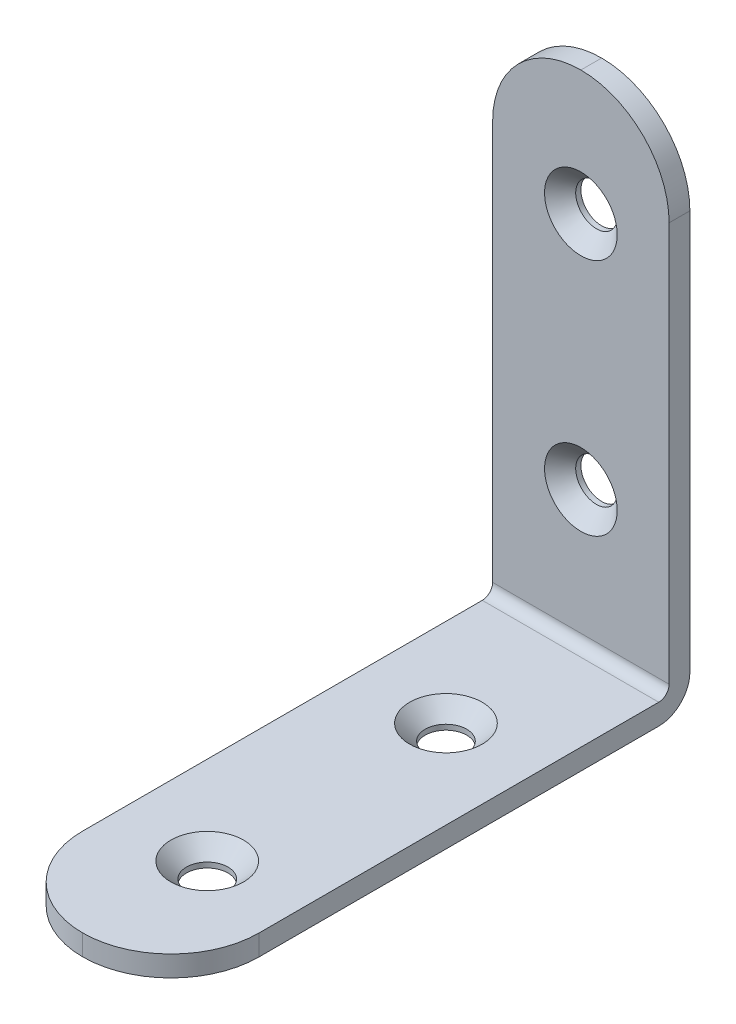
ISO-10303-21;
HEADER;
FILE_DESCRIPTION(('STEP AP214'),'2;1');
FILE_NAME('part.step','',(''),(''),'','','');
FILE_SCHEMA(('AUTOMOTIVE_DESIGN { 1 0 10303 214 1 1 1 1 }'));
ENDSEC;
DATA;
#1=APPLICATION_CONTEXT('core data for automotive mechanical design processes');
#2=APPLICATION_PROTOCOL_DEFINITION('international standard','automotive_design',2000,#1);
#3=PRODUCT_CONTEXT('',#1,'mechanical');
#4=PRODUCT('Part','Part','',(#3));
#5=PRODUCT_RELATED_PRODUCT_CATEGORY('part','',(#4));
#6=PRODUCT_DEFINITION_FORMATION('','',#4);
#7=PRODUCT_DEFINITION_CONTEXT('part definition',#1,'design');
#8=PRODUCT_DEFINITION('design','',#6,#7);
#9=PRODUCT_DEFINITION_SHAPE('','',#8);
#10=(LENGTH_UNIT() NAMED_UNIT(*) SI_UNIT(.MILLI.,.METRE.));
#11=(NAMED_UNIT(*) PLANE_ANGLE_UNIT() SI_UNIT($,.RADIAN.));
#12=(NAMED_UNIT(*) SI_UNIT($,.STERADIAN.) SOLID_ANGLE_UNIT());
#13=UNCERTAINTY_MEASURE_WITH_UNIT(LENGTH_MEASURE(1.E-05),#10,'distance_accuracy_value','');
#14=(GEOMETRIC_REPRESENTATION_CONTEXT(3) GLOBAL_UNCERTAINTY_ASSIGNED_CONTEXT((#13)) GLOBAL_UNIT_ASSIGNED_CONTEXT((#10,
#11,#12)) REPRESENTATION_CONTEXT('',''));
#15=CARTESIAN_POINT('',(0.,0.,0.));
#16=DIRECTION('',(0.,0.,1.));
#17=DIRECTION('',(1.,0.,0.));
#18=AXIS2_PLACEMENT_3D('',#15,#16,#17);
#19=CARTESIAN_POINT('',(-8.5,2.,50.));
#20=DIRECTION('',(0.,1.,0.));
#21=DIRECTION('',(0.,0.,1.));
#22=AXIS2_PLACEMENT_3D('',#19,#20,#21);
#23=PLANE('',#22);
#24=CARTESIAN_POINT('',(0.,2.,15.));
#25=DIRECTION('',(0.,1.,0.));
#26=DIRECTION('',(0.,0.,1.));
#27=AXIS2_PLACEMENT_3D('',#24,#25,#26);
#28=CIRCLE('',#27,3.5);
#29=CARTESIAN_POINT('',(0.,2.,18.5));
#30=VERTEX_POINT('',#29);
#31=EDGE_CURVE('E211',#30,#30,#28,.F.);
#32=ORIENTED_EDGE('',*,*,#31,.T.);
#33=EDGE_LOOP('',(#32));
#34=FACE_BOUND('',#33,.T.);
#35=CARTESIAN_POINT('',(0.,2.,38.));
#36=DIRECTION('',(0.,1.,0.));
#37=DIRECTION('',(0.,0.,1.));
#38=AXIS2_PLACEMENT_3D('',#35,#36,#37);
#39=CIRCLE('',#38,3.5);
#40=CARTESIAN_POINT('',(0.,2.,41.5));
#41=VERTEX_POINT('',#40);
#42=EDGE_CURVE('E208',#41,#41,#39,.F.);
#43=ORIENTED_EDGE('',*,*,#42,.T.);
#44=EDGE_LOOP('',(#43));
#45=FACE_BOUND('',#44,.T.);
#46=CARTESIAN_POINT('',(0.,2.,41.5));
#47=DIRECTION('',(0.,1.,0.));
#48=DIRECTION('',(0.,0.,1.));
#49=AXIS2_PLACEMENT_3D('',#46,#47,#48);
#50=CIRCLE('',#49,8.5);
#51=CARTESIAN_POINT('',(-8.5,2.,41.5));
#52=VERTEX_POINT('',#51);
#53=CARTESIAN_POINT('',(0.,2.,50.));
#54=VERTEX_POINT('',#53);
#55=EDGE_CURVE('E50',#52,#54,#50,.T.);
#56=ORIENTED_EDGE('',*,*,#55,.T.);
#57=CARTESIAN_POINT('',(0.,2.,41.5));
#58=DIRECTION('',(0.,1.,0.));
#59=DIRECTION('',(0.,0.,1.));
#60=AXIS2_PLACEMENT_3D('',#57,#58,#59);
#61=CIRCLE('',#60,8.5);
#62=CARTESIAN_POINT('',(8.5,2.,41.5));
#63=VERTEX_POINT('',#62);
#64=EDGE_CURVE('E198',#54,#63,#61,.T.);
#65=ORIENTED_EDGE('',*,*,#64,.T.);
#66=DIRECTION('',(0.,0.,1.));
#67=VECTOR('',#66,1.);
#68=CARTESIAN_POINT('',(8.5,2.,50.));
#69=LINE('',#68,#67);
#70=CARTESIAN_POINT('',(8.5,2.,3.));
#71=VERTEX_POINT('',#70);
#72=EDGE_CURVE('E146',#71,#63,#69,.T.);
#73=ORIENTED_EDGE('',*,*,#72,.F.);
#74=DIRECTION('',(1.,0.,0.));
#75=VECTOR('',#74,1.);
#76=CARTESIAN_POINT('',(-8.5,2.,3.));
#77=LINE('',#76,#75);
#78=CARTESIAN_POINT('',(-8.5,2.,3.));
#79=VERTEX_POINT('',#78);
#80=EDGE_CURVE('E160',#79,#71,#77,.T.);
#81=ORIENTED_EDGE('',*,*,#80,.F.);
#82=DIRECTION('',(0.,0.,1.));
#83=VECTOR('',#82,1.);
#84=CARTESIAN_POINT('',(-8.5,2.,50.));
#85=LINE('',#84,#83);
#86=EDGE_CURVE('E134',#79,#52,#85,.T.);
#87=ORIENTED_EDGE('',*,*,#86,.T.);
#88=EDGE_LOOP('',(#56,#65,#73,#81,#87));
#89=FACE_BOUND('',#88,.T.);
#90=ADVANCED_FACE('F35',(#34,#45,#89),#23,.T.);
#91=CARTESIAN_POINT('',(-8.5,3.,3.));
#92=DIRECTION('',(1.,0.,0.));
#93=DIRECTION('',(0.,0.,-1.));
#94=AXIS2_PLACEMENT_3D('',#91,#92,#93);
#95=CYLINDRICAL_SURFACE('',#94,1.);
#96=ORIENTED_EDGE('',*,*,#80,.T.);
#97=CARTESIAN_POINT('',(8.5,3.,3.));
#98=DIRECTION('',(-1.,0.,0.));
#99=DIRECTION('',(0.,0.,-1.));
#100=AXIS2_PLACEMENT_3D('',#97,#98,#99);
#101=CIRCLE('',#100,1.);
#102=CARTESIAN_POINT('',(8.5,3.,2.));
#103=VERTEX_POINT('',#102);
#104=EDGE_CURVE('E143',#103,#71,#101,.T.);
#105=ORIENTED_EDGE('',*,*,#104,.F.);
#106=DIRECTION('',(1.,0.,0.));
#107=VECTOR('',#106,1.);
#108=CARTESIAN_POINT('',(-8.5,3.,2.));
#109=LINE('',#108,#107);
#110=CARTESIAN_POINT('',(-8.5,3.,2.));
#111=VERTEX_POINT('',#110);
#112=EDGE_CURVE('E162',#111,#103,#109,.T.);
#113=ORIENTED_EDGE('',*,*,#112,.F.);
#114=CARTESIAN_POINT('',(-8.5,3.,3.));
#115=DIRECTION('',(-1.,0.,0.));
#116=DIRECTION('',(0.,0.,-1.));
#117=AXIS2_PLACEMENT_3D('',#114,#115,#116);
#118=CIRCLE('',#117,1.);
#119=EDGE_CURVE('E156',#111,#79,#118,.T.);
#120=ORIENTED_EDGE('',*,*,#119,.T.);
#121=EDGE_LOOP('',(#96,#105,#113,#120));
#122=FACE_BOUND('',#121,.T.);
#123=ADVANCED_FACE('F242',(#122),#95,.F.);
#124=CARTESIAN_POINT('',(-8.5,3.,2.));
#125=DIRECTION('',(0.,0.,1.));
#126=DIRECTION('',(0.,-1.,0.));
#127=AXIS2_PLACEMENT_3D('',#124,#125,#126);
#128=PLANE('',#127);
#129=CARTESIAN_POINT('',(0.,15.,2.));
#130=DIRECTION('',(0.,0.,1.));
#131=DIRECTION('',(0.,-1.,0.));
#132=AXIS2_PLACEMENT_3D('',#129,#130,#131);
#133=CIRCLE('',#132,3.5);
#134=CARTESIAN_POINT('',(3.5,15.,2.));
#135=VERTEX_POINT('',#134);
#136=EDGE_CURVE('E220',#135,#135,#133,.F.);
#137=ORIENTED_EDGE('',*,*,#136,.T.);
#138=EDGE_LOOP('',(#137));
#139=FACE_BOUND('',#138,.T.);
#140=CARTESIAN_POINT('',(0.,38.,2.));
#141=DIRECTION('',(0.,0.,1.));
#142=DIRECTION('',(0.,-1.,0.));
#143=AXIS2_PLACEMENT_3D('',#140,#141,#142);
#144=CIRCLE('',#143,3.5);
#145=CARTESIAN_POINT('',(3.5,38.,2.));
#146=VERTEX_POINT('',#145);
#147=EDGE_CURVE('E217',#146,#146,#144,.F.);
#148=ORIENTED_EDGE('',*,*,#147,.T.);
#149=EDGE_LOOP('',(#148));
#150=FACE_BOUND('',#149,.T.);
#151=DIRECTION('',(0.,-1.,0.));
#152=VECTOR('',#151,1.);
#153=CARTESIAN_POINT('',(8.5,3.,2.));
#154=LINE('',#153,#152);
#155=CARTESIAN_POINT('',(8.5,41.5,2.));
#156=VERTEX_POINT('',#155);
#157=EDGE_CURVE('E139',#156,#103,#154,.T.);
#158=ORIENTED_EDGE('',*,*,#157,.F.);
#159=CARTESIAN_POINT('',(0.,41.5,2.));
#160=DIRECTION('',(0.,0.,1.));
#161=DIRECTION('',(0.,-1.,0.));
#162=AXIS2_PLACEMENT_3D('',#159,#160,#161);
#163=CIRCLE('',#162,8.5);
#164=CARTESIAN_POINT('',(0.,50.,2.));
#165=VERTEX_POINT('',#164);
#166=EDGE_CURVE('E184',#156,#165,#163,.T.);
#167=ORIENTED_EDGE('',*,*,#166,.T.);
#168=CARTESIAN_POINT('',(0.,41.5,2.));
#169=DIRECTION('',(0.,0.,1.));
#170=DIRECTION('',(0.,-1.,0.));
#171=AXIS2_PLACEMENT_3D('',#168,#169,#170);
#172=CIRCLE('',#171,8.5);
#173=CARTESIAN_POINT('',(-8.5,41.5,2.));
#174=VERTEX_POINT('',#173);
#175=EDGE_CURVE('E182',#165,#174,#172,.T.);
#176=ORIENTED_EDGE('',*,*,#175,.T.);
#177=DIRECTION('',(0.,-1.,0.));
#178=VECTOR('',#177,1.);
#179=CARTESIAN_POINT('',(-8.5,3.,2.));
#180=LINE('',#179,#178);
#181=EDGE_CURVE('E154',#174,#111,#180,.T.);
#182=ORIENTED_EDGE('',*,*,#181,.T.);
#183=ORIENTED_EDGE('',*,*,#112,.T.);
#184=EDGE_LOOP('',(#158,#167,#176,#182,#183));
#185=FACE_BOUND('',#184,.T.);
#186=ADVANCED_FACE('F248',(#139,#150,#185),#128,.T.);
#187=CARTESIAN_POINT('',(-8.5,3.,0.));
#188=DIRECTION('',(0.,0.,-1.));
#189=DIRECTION('',(-1.,0.,0.));
#190=AXIS2_PLACEMENT_3D('',#187,#188,#189);
#191=PLANE('',#190);
#192=CARTESIAN_POINT('',(0.,15.,0.));
#193=DIRECTION('',(0.,0.,-1.));
#194=DIRECTION('',(-1.,0.,0.));
#195=AXIS2_PLACEMENT_3D('',#192,#193,#194);
#196=CIRCLE('',#195,2.);
#197=CARTESIAN_POINT('',(-2.,15.,0.));
#198=VERTEX_POINT('',#197);
#199=EDGE_CURVE('E174',#198,#198,#196,.T.);
#200=ORIENTED_EDGE('',*,*,#199,.F.);
#201=EDGE_LOOP('',(#200));
#202=FACE_BOUND('',#201,.T.);
#203=CARTESIAN_POINT('',(0.,38.,0.));
#204=DIRECTION('',(0.,0.,-1.));
#205=DIRECTION('',(-1.,0.,0.));
#206=AXIS2_PLACEMENT_3D('',#203,#204,#205);
#207=CIRCLE('',#206,2.);
#208=CARTESIAN_POINT('',(-2.,38.,0.));
#209=VERTEX_POINT('',#208);
#210=EDGE_CURVE('E171',#209,#209,#207,.T.);
#211=ORIENTED_EDGE('',*,*,#210,.F.);
#212=EDGE_LOOP('',(#211));
#213=FACE_BOUND('',#212,.T.);
#214=CARTESIAN_POINT('',(0.,41.5,0.));
#215=DIRECTION('',(0.,0.,-1.));
#216=DIRECTION('',(-1.,0.,0.));
#217=AXIS2_PLACEMENT_3D('',#214,#215,#216);
#218=CIRCLE('',#217,8.5);
#219=CARTESIAN_POINT('',(-8.5,41.5,0.));
#220=VERTEX_POINT('',#219);
#221=CARTESIAN_POINT('',(0.,50.,0.));
#222=VERTEX_POINT('',#221);
#223=EDGE_CURVE('E186',#220,#222,#218,.T.);
#224=ORIENTED_EDGE('',*,*,#223,.T.);
#225=CARTESIAN_POINT('',(0.,41.5,0.));
#226=DIRECTION('',(0.,0.,-1.));
#227=DIRECTION('',(-1.,0.,0.));
#228=AXIS2_PLACEMENT_3D('',#225,#226,#227);
#229=CIRCLE('',#228,8.5);
#230=CARTESIAN_POINT('',(8.5,41.5,0.));
#231=VERTEX_POINT('',#230);
#232=EDGE_CURVE('E188',#222,#231,#229,.T.);
#233=ORIENTED_EDGE('',*,*,#232,.T.);
#234=DIRECTION('',(0.,1.,0.));
#235=VECTOR('',#234,1.);
#236=CARTESIAN_POINT('',(8.5,3.,0.));
#237=LINE('',#236,#235);
#238=CARTESIAN_POINT('',(8.5,3.,0.));
#239=VERTEX_POINT('',#238);
#240=EDGE_CURVE('E137',#239,#231,#237,.T.);
#241=ORIENTED_EDGE('',*,*,#240,.F.);
#242=DIRECTION('',(1.,0.,0.));
#243=VECTOR('',#242,1.);
#244=CARTESIAN_POINT('',(-8.5,3.,0.));
#245=LINE('',#244,#243);
#246=CARTESIAN_POINT('',(-8.5,3.,0.));
#247=VERTEX_POINT('',#246);
#248=EDGE_CURVE('E133',#247,#239,#245,.T.);
#249=ORIENTED_EDGE('',*,*,#248,.F.);
#250=DIRECTION('',(0.,1.,0.));
#251=VECTOR('',#250,1.);
#252=CARTESIAN_POINT('',(-8.5,3.,0.));
#253=LINE('',#252,#251);
#254=EDGE_CURVE('E151',#247,#220,#253,.T.);
#255=ORIENTED_EDGE('',*,*,#254,.T.);
#256=EDGE_LOOP('',(#224,#233,#241,#249,#255));
#257=FACE_BOUND('',#256,.T.);
#258=ADVANCED_FACE('F258',(#202,#213,#257),#191,.T.);
#259=CARTESIAN_POINT('',(-8.5,3.,3.));
#260=DIRECTION('',(1.,0.,0.));
#261=DIRECTION('',(0.,0.,-1.));
#262=AXIS2_PLACEMENT_3D('',#259,#260,#261);
#263=CYLINDRICAL_SURFACE('',#262,3.);
#264=ORIENTED_EDGE('',*,*,#248,.T.);
#265=CARTESIAN_POINT('',(8.5,3.,3.));
#266=DIRECTION('',(1.,0.,0.));
#267=DIRECTION('',(0.,0.,-1.));
#268=AXIS2_PLACEMENT_3D('',#265,#266,#267);
#269=CIRCLE('',#268,3.);
#270=CARTESIAN_POINT('',(8.5,0.,3.));
#271=VERTEX_POINT('',#270);
#272=EDGE_CURVE('E118',#271,#239,#269,.T.);
#273=ORIENTED_EDGE('',*,*,#272,.F.);
#274=DIRECTION('',(1.,0.,0.));
#275=VECTOR('',#274,1.);
#276=CARTESIAN_POINT('',(-8.5,0.,3.));
#277=LINE('',#276,#275);
#278=CARTESIAN_POINT('',(-8.5,0.,3.));
#279=VERTEX_POINT('',#278);
#280=EDGE_CURVE('E126',#279,#271,#277,.T.);
#281=ORIENTED_EDGE('',*,*,#280,.F.);
#282=CARTESIAN_POINT('',(-8.5,3.,3.));
#283=DIRECTION('',(1.,0.,0.));
#284=DIRECTION('',(0.,0.,-1.));
#285=AXIS2_PLACEMENT_3D('',#282,#283,#284);
#286=CIRCLE('',#285,3.);
#287=EDGE_CURVE('E149',#279,#247,#286,.T.);
#288=ORIENTED_EDGE('',*,*,#287,.T.);
#289=EDGE_LOOP('',(#264,#273,#281,#288));
#290=FACE_BOUND('',#289,.T.);
#291=ADVANCED_FACE('F136',(#290),#263,.T.);
#292=CARTESIAN_POINT('',(-8.5,0.,50.));
#293=DIRECTION('',(0.,-1.,0.));
#294=DIRECTION('',(0.,0.,-1.));
#295=AXIS2_PLACEMENT_3D('',#292,#293,#294);
#296=PLANE('',#295);
#297=CARTESIAN_POINT('',(0.,0.,15.));
#298=DIRECTION('',(0.,-1.,0.));
#299=DIRECTION('',(0.,0.,-1.));
#300=AXIS2_PLACEMENT_3D('',#297,#298,#299);
#301=CIRCLE('',#300,2.);
#302=CARTESIAN_POINT('',(0.,0.,13.));
#303=VERTEX_POINT('',#302);
#304=EDGE_CURVE('E168',#303,#303,#301,.T.);
#305=ORIENTED_EDGE('',*,*,#304,.F.);
#306=EDGE_LOOP('',(#305));
#307=FACE_BOUND('',#306,.T.);
#308=CARTESIAN_POINT('',(0.,0.,38.));
#309=DIRECTION('',(0.,-1.,0.));
#310=DIRECTION('',(0.,0.,-1.));
#311=AXIS2_PLACEMENT_3D('',#308,#309,#310);
#312=CIRCLE('',#311,2.);
#313=CARTESIAN_POINT('',(0.,0.,36.));
#314=VERTEX_POINT('',#313);
#315=EDGE_CURVE('E123',#314,#314,#312,.T.);
#316=ORIENTED_EDGE('',*,*,#315,.F.);
#317=EDGE_LOOP('',(#316));
#318=FACE_BOUND('',#317,.T.);
#319=DIRECTION('',(0.,0.,-1.));
#320=VECTOR('',#319,1.);
#321=CARTESIAN_POINT('',(8.5,0.,50.));
#322=LINE('',#321,#320);
#323=CARTESIAN_POINT('',(8.5,0.,41.5));
#324=VERTEX_POINT('',#323);
#325=EDGE_CURVE('E113',#324,#271,#322,.T.);
#326=ORIENTED_EDGE('',*,*,#325,.F.);
#327=CARTESIAN_POINT('',(0.,0.,41.5));
#328=DIRECTION('',(0.,-1.,0.));
#329=DIRECTION('',(0.,0.,-1.));
#330=AXIS2_PLACEMENT_3D('',#327,#328,#329);
#331=CIRCLE('',#330,8.5);
#332=CARTESIAN_POINT('',(0.,0.,50.));
#333=VERTEX_POINT('',#332);
#334=EDGE_CURVE('E58',#324,#333,#331,.T.);
#335=ORIENTED_EDGE('',*,*,#334,.T.);
#336=CARTESIAN_POINT('',(0.,0.,41.5));
#337=DIRECTION('',(0.,-1.,0.));
#338=DIRECTION('',(0.,0.,-1.));
#339=AXIS2_PLACEMENT_3D('',#336,#337,#338);
#340=CIRCLE('',#339,8.5);
#341=CARTESIAN_POINT('',(-8.5,0.,41.5));
#342=VERTEX_POINT('',#341);
#343=EDGE_CURVE('E194',#333,#342,#340,.T.);
#344=ORIENTED_EDGE('',*,*,#343,.T.);
#345=DIRECTION('',(0.,0.,-1.));
#346=VECTOR('',#345,1.);
#347=CARTESIAN_POINT('',(-8.5,0.,50.));
#348=LINE('',#347,#346);
#349=EDGE_CURVE('E129',#342,#279,#348,.T.);
#350=ORIENTED_EDGE('',*,*,#349,.T.);
#351=ORIENTED_EDGE('',*,*,#280,.T.);
#352=EDGE_LOOP('',(#326,#335,#344,#350,#351));
#353=FACE_BOUND('',#352,.T.);
#354=ADVANCED_FACE('F127',(#307,#318,#353),#296,.T.);
#355=CARTESIAN_POINT('',(-8.5,3.,3.));
#356=DIRECTION('',(1.,0.,0.));
#357=DIRECTION('',(0.,0.,-1.));
#358=AXIS2_PLACEMENT_3D('',#355,#356,#357);
#359=PLANE('',#358);
#360=ORIENTED_EDGE('',*,*,#181,.F.);
#361=DIRECTION('',(0.,0.,1.));
#362=VECTOR('',#361,1.);
#363=CARTESIAN_POINT('',(-8.5,41.5,0.));
#364=LINE('',#363,#362);
#365=EDGE_CURVE('E192',#174,#220,#364,.F.);
#366=ORIENTED_EDGE('',*,*,#365,.T.);
#367=ORIENTED_EDGE('',*,*,#254,.F.);
#368=ORIENTED_EDGE('',*,*,#287,.F.);
#369=ORIENTED_EDGE('',*,*,#349,.F.);
#370=DIRECTION('',(0.,-1.,0.));
#371=VECTOR('',#370,1.);
#372=CARTESIAN_POINT('',(-8.5,2.,41.5));
#373=LINE('',#372,#371);
#374=EDGE_CURVE('E190',#342,#52,#373,.F.);
#375=ORIENTED_EDGE('',*,*,#374,.T.);
#376=ORIENTED_EDGE('',*,*,#86,.F.);
#377=ORIENTED_EDGE('',*,*,#119,.F.);
#378=EDGE_LOOP('',(#360,#366,#367,#368,#369,#375,#376,#377));
#379=FACE_BOUND('',#378,.T.);
#380=ADVANCED_FACE('F253',(#379),#359,.F.);
#381=CARTESIAN_POINT('',(8.5,3.,3.));
#382=DIRECTION('',(1.,0.,0.));
#383=DIRECTION('',(0.,0.,-1.));
#384=AXIS2_PLACEMENT_3D('',#381,#382,#383);
#385=PLANE('',#384);
#386=ORIENTED_EDGE('',*,*,#240,.T.);
#387=DIRECTION('',(0.,0.,1.));
#388=VECTOR('',#387,1.);
#389=CARTESIAN_POINT('',(8.5,41.5,3.));
#390=LINE('',#389,#388);
#391=EDGE_CURVE('E179',#231,#156,#390,.T.);
#392=ORIENTED_EDGE('',*,*,#391,.T.);
#393=ORIENTED_EDGE('',*,*,#157,.T.);
#394=ORIENTED_EDGE('',*,*,#104,.T.);
#395=ORIENTED_EDGE('',*,*,#72,.T.);
#396=DIRECTION('',(0.,-1.,0.));
#397=VECTOR('',#396,1.);
#398=CARTESIAN_POINT('',(8.5,3.,41.5));
#399=LINE('',#398,#397);
#400=EDGE_CURVE('E122',#63,#324,#399,.T.);
#401=ORIENTED_EDGE('',*,*,#400,.T.);
#402=ORIENTED_EDGE('',*,*,#325,.T.);
#403=ORIENTED_EDGE('',*,*,#272,.T.);
#404=EDGE_LOOP('',(#386,#392,#393,#394,#395,#401,#402,#403));
#405=FACE_BOUND('',#404,.T.);
#406=ADVANCED_FACE('F116',(#405),#385,.T.);
#407=CARTESIAN_POINT('',(0.,-13.5,38.));
#408=DIRECTION('',(0.,1.,0.));
#409=DIRECTION('',(0.,0.,1.));
#410=AXIS2_PLACEMENT_3D('',#407,#408,#409);
#411=CYLINDRICAL_SURFACE('',#410,2.);
#412=CARTESIAN_POINT('',(0.,0.500000000000014,38.));
#413=DIRECTION('',(0.,1.,0.));
#414=DIRECTION('',(0.,0.,1.));
#415=AXIS2_PLACEMENT_3D('',#412,#413,#414);
#416=CIRCLE('',#415,2.);
#417=CARTESIAN_POINT('',(0.,0.500000000000014,40.));
#418=VERTEX_POINT('',#417);
#419=EDGE_CURVE('E11',#418,#418,#416,.T.);
#420=ORIENTED_EDGE('',*,*,#419,.T.);
#421=EDGE_LOOP('',(#420));
#422=FACE_BOUND('',#421,.T.);
#423=ORIENTED_EDGE('',*,*,#315,.T.);
#424=EDGE_LOOP('',(#423));
#425=FACE_BOUND('',#424,.T.);
#426=ADVANCED_FACE('F296',(#422,#425),#411,.F.);
#427=CARTESIAN_POINT('',(0.,-13.5,15.));
#428=DIRECTION('',(0.,1.,0.));
#429=DIRECTION('',(0.,0.,1.));
#430=AXIS2_PLACEMENT_3D('',#427,#428,#429);
#431=CYLINDRICAL_SURFACE('',#430,2.);
#432=CARTESIAN_POINT('',(0.,0.500000000000016,15.));
#433=DIRECTION('',(0.,1.,0.));
#434=DIRECTION('',(0.,0.,1.));
#435=AXIS2_PLACEMENT_3D('',#432,#433,#434);
#436=CIRCLE('',#435,2.);
#437=CARTESIAN_POINT('',(0.,0.500000000000016,17.));
#438=VERTEX_POINT('',#437);
#439=EDGE_CURVE('E200',#438,#438,#436,.T.);
#440=ORIENTED_EDGE('',*,*,#439,.T.);
#441=EDGE_LOOP('',(#440));
#442=FACE_BOUND('',#441,.T.);
#443=ORIENTED_EDGE('',*,*,#304,.T.);
#444=EDGE_LOOP('',(#443));
#445=FACE_BOUND('',#444,.T.);
#446=ADVANCED_FACE('F293',(#442,#445),#431,.F.);
#447=CARTESIAN_POINT('',(0.,38.,-13.5));
#448=DIRECTION('',(0.,0.,1.));
#449=DIRECTION('',(1.,0.,0.));
#450=AXIS2_PLACEMENT_3D('',#447,#448,#449);
#451=CYLINDRICAL_SURFACE('',#450,2.);
#452=CARTESIAN_POINT('',(0.,38.,0.500000000000013));
#453=DIRECTION('',(0.,0.,1.));
#454=DIRECTION('',(1.,0.,0.));
#455=AXIS2_PLACEMENT_3D('',#452,#453,#454);
#456=CIRCLE('',#455,2.);
#457=CARTESIAN_POINT('',(2.,38.,0.500000000000012));
#458=VERTEX_POINT('',#457);
#459=EDGE_CURVE('E43',#458,#458,#456,.T.);
#460=ORIENTED_EDGE('',*,*,#459,.T.);
#461=EDGE_LOOP('',(#460));
#462=FACE_BOUND('',#461,.T.);
#463=ORIENTED_EDGE('',*,*,#210,.T.);
#464=EDGE_LOOP('',(#463));
#465=FACE_BOUND('',#464,.T.);
#466=ADVANCED_FACE('F225',(#462,#465),#451,.F.);
#467=CARTESIAN_POINT('',(0.,15.,-13.5));
#468=DIRECTION('',(0.,0.,1.));
#469=DIRECTION('',(1.,0.,0.));
#470=AXIS2_PLACEMENT_3D('',#467,#468,#469);
#471=CYLINDRICAL_SURFACE('',#470,2.);
#472=CARTESIAN_POINT('',(0.,15.,0.500000000000013));
#473=DIRECTION('',(0.,0.,1.));
#474=DIRECTION('',(1.,0.,0.));
#475=AXIS2_PLACEMENT_3D('',#472,#473,#474);
#476=CIRCLE('',#475,2.);
#477=CARTESIAN_POINT('',(2.,15.,0.500000000000012));
#478=VERTEX_POINT('',#477);
#479=EDGE_CURVE('E214',#478,#478,#476,.T.);
#480=ORIENTED_EDGE('',*,*,#479,.T.);
#481=EDGE_LOOP('',(#480));
#482=FACE_BOUND('',#481,.T.);
#483=ORIENTED_EDGE('',*,*,#199,.T.);
#484=EDGE_LOOP('',(#483));
#485=FACE_BOUND('',#484,.T.);
#486=ADVANCED_FACE('F276',(#482,#485),#471,.F.);
#487=CARTESIAN_POINT('',(0.,41.5,0.));
#488=DIRECTION('',(0.,0.,-1.));
#489=DIRECTION('',(-1.,0.,0.));
#490=AXIS2_PLACEMENT_3D('',#487,#488,#489);
#491=CYLINDRICAL_SURFACE('',#490,8.5);
#492=DIRECTION('',(0.,0.,1.));
#493=VECTOR('',#492,1.);
#494=CARTESIAN_POINT('',(0.,50.,2.));
#495=LINE('',#494,#493);
#496=EDGE_CURVE('E177',#222,#165,#495,.T.);
#497=ORIENTED_EDGE('',*,*,#496,.F.);
#498=ORIENTED_EDGE('',*,*,#223,.F.);
#499=ORIENTED_EDGE('',*,*,#365,.F.);
#500=ORIENTED_EDGE('',*,*,#175,.F.);
#501=EDGE_LOOP('',(#497,#498,#499,#500));
#502=FACE_BOUND('',#501,.T.);
#503=ADVANCED_FACE('F272',(#502),#491,.T.);
#504=CARTESIAN_POINT('',(0.,41.5,3.));
#505=DIRECTION('',(0.,0.,1.));
#506=DIRECTION('',(1.,0.,0.));
#507=AXIS2_PLACEMENT_3D('',#504,#505,#506);
#508=CYLINDRICAL_SURFACE('',#507,8.5);
#509=ORIENTED_EDGE('',*,*,#232,.F.);
#510=ORIENTED_EDGE('',*,*,#496,.T.);
#511=ORIENTED_EDGE('',*,*,#166,.F.);
#512=ORIENTED_EDGE('',*,*,#391,.F.);
#513=EDGE_LOOP('',(#509,#510,#511,#512));
#514=FACE_BOUND('',#513,.T.);
#515=ADVANCED_FACE('F268',(#514),#508,.T.);
#516=CARTESIAN_POINT('',(0.,0.,41.5));
#517=DIRECTION('',(0.,1.,0.));
#518=DIRECTION('',(0.,0.,1.));
#519=AXIS2_PLACEMENT_3D('',#516,#517,#518);
#520=CYLINDRICAL_SURFACE('',#519,8.5);
#521=DIRECTION('',(0.,-1.,0.));
#522=VECTOR('',#521,1.);
#523=CARTESIAN_POINT('',(0.,0.,50.));
#524=LINE('',#523,#522);
#525=EDGE_CURVE('E203',#54,#333,#524,.T.);
#526=ORIENTED_EDGE('',*,*,#525,.F.);
#527=ORIENTED_EDGE('',*,*,#55,.F.);
#528=ORIENTED_EDGE('',*,*,#374,.F.);
#529=ORIENTED_EDGE('',*,*,#343,.F.);
#530=EDGE_LOOP('',(#526,#527,#528,#529));
#531=FACE_BOUND('',#530,.T.);
#532=ADVANCED_FACE('F271',(#531),#520,.T.);
#533=CARTESIAN_POINT('',(0.,3.,41.5));
#534=DIRECTION('',(0.,-1.,0.));
#535=DIRECTION('',(0.,0.,-1.));
#536=AXIS2_PLACEMENT_3D('',#533,#534,#535);
#537=CYLINDRICAL_SURFACE('',#536,8.5);
#538=ORIENTED_EDGE('',*,*,#64,.F.);
#539=ORIENTED_EDGE('',*,*,#525,.T.);
#540=ORIENTED_EDGE('',*,*,#334,.F.);
#541=ORIENTED_EDGE('',*,*,#400,.F.);
#542=EDGE_LOOP('',(#538,#539,#540,#541));
#543=FACE_BOUND('',#542,.T.);
#544=ADVANCED_FACE('F278',(#543),#537,.T.);
#545=CARTESIAN_POINT('',(0.,0.500000000000016,15.));
#546=DIRECTION('',(0.,1.,0.));
#547=DIRECTION('',(0.,0.,1.));
#548=AXIS2_PLACEMENT_3D('',#545,#546,#547);
#549=CONICAL_SURFACE('',#548,2.,0.785398163397451);
#550=ORIENTED_EDGE('',*,*,#31,.F.);
#551=EDGE_LOOP('',(#550));
#552=FACE_BOUND('',#551,.T.);
#553=ORIENTED_EDGE('',*,*,#439,.F.);
#554=EDGE_LOOP('',(#553));
#555=FACE_BOUND('',#554,.T.);
#556=ADVANCED_FACE('F237',(#552,#555),#549,.F.);
#557=CARTESIAN_POINT('',(0.,15.,0.500000000000013));
#558=DIRECTION('',(0.,0.,1.));
#559=DIRECTION('',(1.,0.,0.));
#560=AXIS2_PLACEMENT_3D('',#557,#558,#559);
#561=CONICAL_SURFACE('',#560,2.,0.78539816339745);
#562=CARTESIAN_POINT('',(3.5,15.,2.));
#563=CARTESIAN_POINT('',(3.484375,15.,1.984375));
#564=CARTESIAN_POINT('',(3.46875,15.,1.96875));
#565=CARTESIAN_POINT('',(3.4375,15.,1.9375));
#566=CARTESIAN_POINT('',(3.421875,15.,1.921875));
#567=CARTESIAN_POINT('',(3.390625,15.,1.890625));
#568=CARTESIAN_POINT('',(3.375,15.,1.875));
#569=CARTESIAN_POINT('',(3.34375,15.,1.84375));
#570=CARTESIAN_POINT('',(3.328125,15.,1.828125));
#571=CARTESIAN_POINT('',(3.296875,15.,1.796875));
#572=CARTESIAN_POINT('',(3.28125,15.,1.78125));
#573=CARTESIAN_POINT('',(3.25,15.,1.75));
#574=CARTESIAN_POINT('',(3.234375,15.,1.734375));
#575=CARTESIAN_POINT('',(3.203125,15.,1.703125));
#576=CARTESIAN_POINT('',(3.1875,15.,1.6875));
#577=CARTESIAN_POINT('',(3.15625,15.,1.65625));
#578=CARTESIAN_POINT('',(3.140625,15.,1.640625));
#579=CARTESIAN_POINT('',(3.109375,15.,1.609375));
#580=CARTESIAN_POINT('',(3.09375,15.,1.59375));
#581=CARTESIAN_POINT('',(3.0625,15.,1.5625));
#582=CARTESIAN_POINT('',(3.046875,15.,1.546875));
#583=CARTESIAN_POINT('',(3.015625,15.,1.515625));
#584=CARTESIAN_POINT('',(3.,15.,1.5));
#585=CARTESIAN_POINT('',(2.96875,15.,1.46875));
#586=CARTESIAN_POINT('',(2.953125,15.,1.453125));
#587=CARTESIAN_POINT('',(2.921875,15.,1.421875));
#588=CARTESIAN_POINT('',(2.90625,15.,1.40625));
#589=CARTESIAN_POINT('',(2.875,15.,1.375));
#590=CARTESIAN_POINT('',(2.859375,15.,1.359375));
#591=CARTESIAN_POINT('',(2.828125,15.,1.32812500000001));
#592=CARTESIAN_POINT('',(2.8125,15.,1.31250000000001));
#593=CARTESIAN_POINT('',(2.78125,15.,1.28125000000001));
#594=CARTESIAN_POINT('',(2.765625,15.,1.26562500000001));
#595=CARTESIAN_POINT('',(2.734375,15.,1.23437500000001));
#596=CARTESIAN_POINT('',(2.71875,15.,1.21875000000001));
#597=CARTESIAN_POINT('',(2.6875,15.,1.18750000000001));
#598=CARTESIAN_POINT('',(2.671875,15.,1.17187500000001));
#599=CARTESIAN_POINT('',(2.640625,15.,1.14062500000001));
#600=CARTESIAN_POINT('',(2.625,15.,1.12500000000001));
#601=CARTESIAN_POINT('',(2.59375,15.,1.09375000000001));
#602=CARTESIAN_POINT('',(2.578125,15.,1.07812500000001));
#603=CARTESIAN_POINT('',(2.546875,15.,1.04687500000001));
#604=CARTESIAN_POINT('',(2.53125,15.,1.03125000000001));
#605=CARTESIAN_POINT('',(2.5,15.,1.00000000000001));
#606=CARTESIAN_POINT('',(2.484375,15.,0.984375000000008));
#607=CARTESIAN_POINT('',(2.453125,15.,0.953125000000009));
#608=CARTESIAN_POINT('',(2.4375,15.,0.937500000000009));
#609=CARTESIAN_POINT('',(2.40625,15.,0.906250000000009));
#610=CARTESIAN_POINT('',(2.390625,15.,0.890625000000009));
#611=CARTESIAN_POINT('',(2.359375,15.,0.85937500000001));
#612=CARTESIAN_POINT('',(2.34375,15.,0.84375000000001));
#613=CARTESIAN_POINT('',(2.3125,15.,0.81250000000001));
#614=CARTESIAN_POINT('',(2.296875,15.,0.79687500000001));
#615=CARTESIAN_POINT('',(2.265625,15.,0.76562500000001));
#616=CARTESIAN_POINT('',(2.25,15.,0.750000000000011));
#617=CARTESIAN_POINT('',(2.21875,15.,0.718750000000011));
#618=CARTESIAN_POINT('',(2.203125,15.,0.703125000000011));
#619=CARTESIAN_POINT('',(2.171875,15.,0.671875000000011));
#620=CARTESIAN_POINT('',(2.15625,15.,0.656250000000011));
#621=CARTESIAN_POINT('',(2.125,15.,0.625000000000012));
#622=CARTESIAN_POINT('',(2.109375,15.,0.609375000000012));
#623=CARTESIAN_POINT('',(2.078125,15.,0.578125000000012));
#624=CARTESIAN_POINT('',(2.0625,15.,0.562500000000012));
#625=CARTESIAN_POINT('',(2.03125,15.,0.531250000000012));
#626=CARTESIAN_POINT('',(2.015625,15.,0.515625000000013));
#627=CARTESIAN_POINT('',(2.,15.,0.500000000000013));
#628=B_SPLINE_CURVE_WITH_KNOTS('',3,(#562,#563,#564,#565,#566,#567,#568,#569,#570,#571,#572,
#573,#574,#575,#576,#577,#578,#579,#580,#581,#582,#583,#584,#585,#586,#587,#588,#589,#590,#591,
#592,#593,#594,#595,#596,#597,#598,#599,#600,#601,#602,#603,#604,#605,#606,#607,#608,#609,#610,
#611,#612,#613,#614,#615,#616,#617,#618,#619,#620,#621,#622,#623,#624,#625,#626,#627),
.UNSPECIFIED.,.F.,.F.,(4,2,2,2,2,2,2,2,2,2,2,2,2,2,2,2,2,2,2,2,2,2,2,2,2,2,2,2,2,2,2,2,4),(0.,
0.0662912607362381,0.132582521472477,0.198873782208715,0.265165042944953,0.331456303681192,
0.39774756441743,0.464038825153669,0.530330085889907,0.596621346626146,0.662912607362384,
0.729203868098622,0.79549512883486,0.861786389571099,0.928077650307337,0.994368911043576,
1.06066017177981,1.12695143251605,1.19324269325229,1.25953395398853,1.32582521472477,
1.39211647546101,1.45840773619724,1.52469899693348,1.59099025766972,1.65728151840596,
1.7235727791422,1.78986403987844,1.85615530061467,1.92244656135091,1.98873782208715,
2.05502908282339,2.12132034355963),.UNSPECIFIED.);
#629=EDGE_CURVE('BSEAM230',#135,#478,#628,.T.);
#630=ORIENTED_EDGE('',*,*,#136,.F.);
#631=ORIENTED_EDGE('',*,*,#479,.F.);
#632=ORIENTED_EDGE('',*,*,#629,.T.);
#633=ORIENTED_EDGE('',*,*,#629,.F.);
#634=EDGE_LOOP('',(#630,#632,#631,#633));
#635=FACE_BOUND('',#634,.T.);
#636=ADVANCED_FACE('F230',(#635),#561,.F.);
#637=CARTESIAN_POINT('',(0.,38.,0.500000000000013));
#638=DIRECTION('',(0.,0.,1.));
#639=DIRECTION('',(1.,0.,0.));
#640=AXIS2_PLACEMENT_3D('',#637,#638,#639);
#641=CONICAL_SURFACE('',#640,2.,0.78539816339745);
#642=CARTESIAN_POINT('',(3.5,38.,2.));
#643=CARTESIAN_POINT('',(3.484375,38.,1.984375));
#644=CARTESIAN_POINT('',(3.46875,38.,1.96875));
#645=CARTESIAN_POINT('',(3.4375,38.,1.9375));
#646=CARTESIAN_POINT('',(3.421875,38.,1.921875));
#647=CARTESIAN_POINT('',(3.390625,38.,1.890625));
#648=CARTESIAN_POINT('',(3.375,38.,1.875));
#649=CARTESIAN_POINT('',(3.34375,38.,1.84375));
#650=CARTESIAN_POINT('',(3.328125,38.,1.828125));
#651=CARTESIAN_POINT('',(3.296875,38.,1.796875));
#652=CARTESIAN_POINT('',(3.28125,38.,1.78125));
#653=CARTESIAN_POINT('',(3.25,38.,1.75));
#654=CARTESIAN_POINT('',(3.234375,38.,1.734375));
#655=CARTESIAN_POINT('',(3.203125,38.,1.703125));
#656=CARTESIAN_POINT('',(3.1875,38.,1.6875));
#657=CARTESIAN_POINT('',(3.15625,38.,1.65625));
#658=CARTESIAN_POINT('',(3.140625,38.,1.640625));
#659=CARTESIAN_POINT('',(3.109375,38.,1.609375));
#660=CARTESIAN_POINT('',(3.09375,38.,1.59375));
#661=CARTESIAN_POINT('',(3.0625,38.,1.5625));
#662=CARTESIAN_POINT('',(3.046875,38.,1.546875));
#663=CARTESIAN_POINT('',(3.015625,38.,1.515625));
#664=CARTESIAN_POINT('',(3.,38.,1.5));
#665=CARTESIAN_POINT('',(2.96875,38.,1.46875));
#666=CARTESIAN_POINT('',(2.953125,38.,1.453125));
#667=CARTESIAN_POINT('',(2.921875,38.,1.421875));
#668=CARTESIAN_POINT('',(2.90625,38.,1.40625));
#669=CARTESIAN_POINT('',(2.875,38.,1.37500000000001));
#670=CARTESIAN_POINT('',(2.859375,38.,1.35937500000001));
#671=CARTESIAN_POINT('',(2.828125,38.,1.32812500000001));
#672=CARTESIAN_POINT('',(2.8125,38.,1.31250000000001));
#673=CARTESIAN_POINT('',(2.78125,38.,1.28125000000001));
#674=CARTESIAN_POINT('',(2.765625,38.,1.26562500000001));
#675=CARTESIAN_POINT('',(2.734375,38.,1.23437500000001));
#676=CARTESIAN_POINT('',(2.71875,38.,1.21875000000001));
#677=CARTESIAN_POINT('',(2.6875,38.,1.18750000000001));
#678=CARTESIAN_POINT('',(2.671875,38.,1.17187500000001));
#679=CARTESIAN_POINT('',(2.640625,38.,1.14062500000001));
#680=CARTESIAN_POINT('',(2.625,38.,1.12500000000001));
#681=CARTESIAN_POINT('',(2.59375,38.,1.09375000000001));
#682=CARTESIAN_POINT('',(2.578125,38.,1.07812500000001));
#683=CARTESIAN_POINT('',(2.546875,38.,1.04687500000001));
#684=CARTESIAN_POINT('',(2.53125,38.,1.03125000000001));
#685=CARTESIAN_POINT('',(2.5,38.,1.00000000000001));
#686=CARTESIAN_POINT('',(2.484375,38.,0.984375000000008));
#687=CARTESIAN_POINT('',(2.453125,38.,0.953125000000009));
#688=CARTESIAN_POINT('',(2.4375,38.,0.937500000000009));
#689=CARTESIAN_POINT('',(2.40625,38.,0.906250000000009));
#690=CARTESIAN_POINT('',(2.390625,38.,0.890625000000009));
#691=CARTESIAN_POINT('',(2.359375,38.,0.85937500000001));
#692=CARTESIAN_POINT('',(2.34375,38.,0.84375000000001));
#693=CARTESIAN_POINT('',(2.3125,38.,0.81250000000001));
#694=CARTESIAN_POINT('',(2.296875,38.,0.79687500000001));
#695=CARTESIAN_POINT('',(2.265625,38.,0.76562500000001));
#696=CARTESIAN_POINT('',(2.25,38.,0.750000000000011));
#697=CARTESIAN_POINT('',(2.21875,38.,0.718750000000011));
#698=CARTESIAN_POINT('',(2.203125,38.,0.703125000000011));
#699=CARTESIAN_POINT('',(2.171875,38.,0.671875000000011));
#700=CARTESIAN_POINT('',(2.15625,38.,0.656250000000011));
#701=CARTESIAN_POINT('',(2.125,38.,0.625000000000012));
#702=CARTESIAN_POINT('',(2.109375,38.,0.609375000000012));
#703=CARTESIAN_POINT('',(2.078125,38.,0.578125000000012));
#704=CARTESIAN_POINT('',(2.0625,38.,0.562500000000012));
#705=CARTESIAN_POINT('',(2.03125,38.,0.531250000000012));
#706=CARTESIAN_POINT('',(2.015625,38.,0.515625000000013));
#707=CARTESIAN_POINT('',(2.,38.,0.500000000000013));
#708=B_SPLINE_CURVE_WITH_KNOTS('',3,(#642,#643,#644,#645,#646,#647,#648,#649,#650,#651,#652,
#653,#654,#655,#656,#657,#658,#659,#660,#661,#662,#663,#664,#665,#666,#667,#668,#669,#670,#671,
#672,#673,#674,#675,#676,#677,#678,#679,#680,#681,#682,#683,#684,#685,#686,#687,#688,#689,#690,
#691,#692,#693,#694,#695,#696,#697,#698,#699,#700,#701,#702,#703,#704,#705,#706,#707),
.UNSPECIFIED.,.F.,.F.,(4,2,2,2,2,2,2,2,2,2,2,2,2,2,2,2,2,2,2,2,2,2,2,2,2,2,2,2,2,2,2,2,4),(0.,
0.0662912607362389,0.132582521472477,0.198873782208716,0.265165042944954,0.331456303681192,
0.397747564417431,0.464038825153669,0.530330085889908,0.596621346626146,0.662912607362384,
0.729203868098623,0.795495128834861,0.861786389571099,0.928077650307338,0.994368911043576,
1.06066017177981,1.12695143251605,1.19324269325229,1.25953395398853,1.32582521472477,
1.39211647546101,1.45840773619724,1.52469899693348,1.59099025766972,1.65728151840596,
1.7235727791422,1.78986403987844,1.85615530061467,1.92244656135091,1.98873782208715,
2.05502908282339,2.12132034355963),.UNSPECIFIED.);
#709=EDGE_CURVE('BSEAM228',#146,#458,#708,.T.);
#710=ORIENTED_EDGE('',*,*,#147,.F.);
#711=ORIENTED_EDGE('',*,*,#459,.F.);
#712=ORIENTED_EDGE('',*,*,#709,.T.);
#713=ORIENTED_EDGE('',*,*,#709,.F.);
#714=EDGE_LOOP('',(#710,#712,#711,#713));
#715=FACE_BOUND('',#714,.T.);
#716=ADVANCED_FACE('F228',(#715),#641,.F.);
#717=CARTESIAN_POINT('',(0.,0.500000000000014,38.));
#718=DIRECTION('',(0.,1.,0.));
#719=DIRECTION('',(0.,0.,1.));
#720=AXIS2_PLACEMENT_3D('',#717,#718,#719);
#721=CONICAL_SURFACE('',#720,2.,0.785398163397451);
#722=ORIENTED_EDGE('',*,*,#42,.F.);
#723=EDGE_LOOP('',(#722));
#724=FACE_BOUND('',#723,.T.);
#725=ORIENTED_EDGE('',*,*,#419,.F.);
#726=EDGE_LOOP('',(#725));
#727=FACE_BOUND('',#726,.T.);
#728=ADVANCED_FACE('F37',(#724,#727),#721,.F.);
#729=CLOSED_SHELL('',(#90,#123,#186,#258,#291,#354,#380,#406,#426,#446,#466,#486,#503,#515,#532,
#544,#556,#636,#716,#728));
#730=MANIFOLD_SOLID_BREP('B2',#729);
#731=ADVANCED_BREP_SHAPE_REPRESENTATION('',(#18,#730),#14);
#732=SHAPE_DEFINITION_REPRESENTATION(#9,#731);
ENDSEC;
END-ISO-10303-21;
